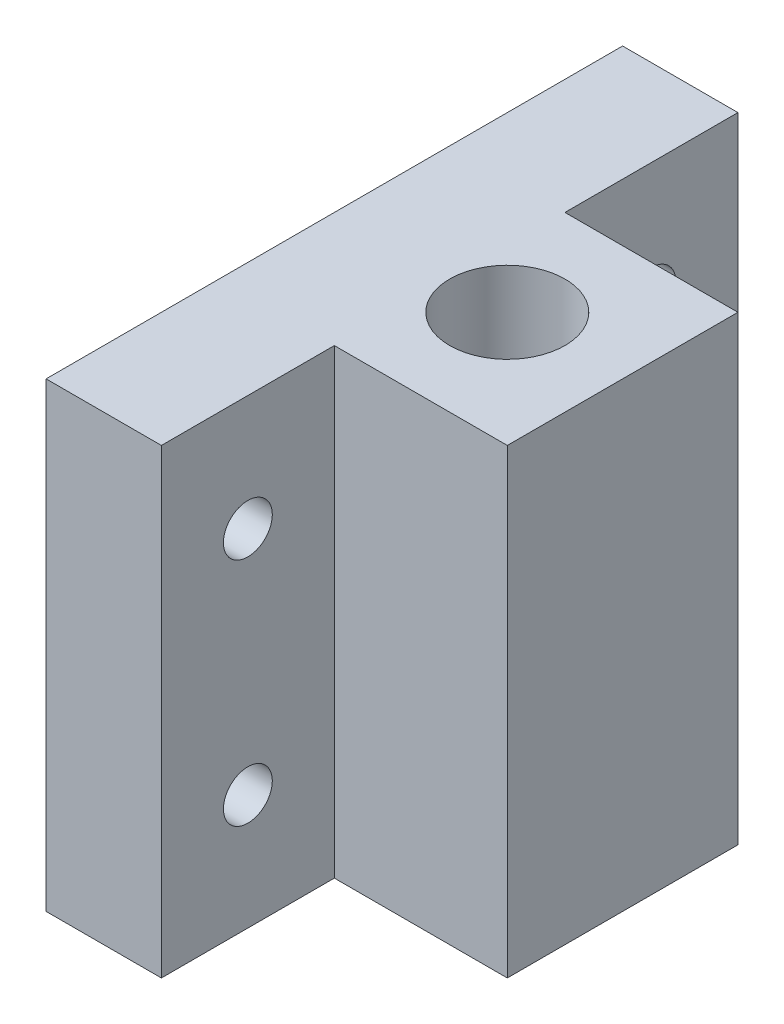
ISO-10303-21;
HEADER;
FILE_DESCRIPTION(('STEP AP214'),'2;1');
FILE_NAME('part.step','',(''),(''),'','','');
FILE_SCHEMA(('AUTOMOTIVE_DESIGN { 1 0 10303 214 1 1 1 1 }'));
ENDSEC;
DATA;
#1=APPLICATION_CONTEXT('core data for automotive mechanical design processes');
#2=APPLICATION_PROTOCOL_DEFINITION('international standard','automotive_design',2000,#1);
#3=PRODUCT_CONTEXT('',#1,'mechanical');
#4=PRODUCT('Part','Part','',(#3));
#5=PRODUCT_RELATED_PRODUCT_CATEGORY('part','',(#4));
#6=PRODUCT_DEFINITION_FORMATION('','',#4);
#7=PRODUCT_DEFINITION_CONTEXT('part definition',#1,'design');
#8=PRODUCT_DEFINITION('design','',#6,#7);
#9=PRODUCT_DEFINITION_SHAPE('','',#8);
#10=(LENGTH_UNIT() NAMED_UNIT(*) SI_UNIT(.MILLI.,.METRE.));
#11=(NAMED_UNIT(*) PLANE_ANGLE_UNIT() SI_UNIT($,.RADIAN.));
#12=(NAMED_UNIT(*) SI_UNIT($,.STERADIAN.) SOLID_ANGLE_UNIT());
#13=UNCERTAINTY_MEASURE_WITH_UNIT(LENGTH_MEASURE(1.E-05),#10,'distance_accuracy_value','');
#14=(GEOMETRIC_REPRESENTATION_CONTEXT(3) GLOBAL_UNCERTAINTY_ASSIGNED_CONTEXT((#13)) GLOBAL_UNIT_ASSIGNED_CONTEXT((#10,
#11,#12)) REPRESENTATION_CONTEXT('',''));
#15=CARTESIAN_POINT('',(0.,0.,0.));
#16=DIRECTION('',(0.,0.,1.));
#17=DIRECTION('',(1.,0.,0.));
#18=AXIS2_PLACEMENT_3D('',#15,#16,#17);
#19=CARTESIAN_POINT('',(30.,0.,0.));
#20=DIRECTION('',(0.,1.,0.));
#21=DIRECTION('',(0.,0.,1.));
#22=AXIS2_PLACEMENT_3D('',#19,#20,#21);
#23=CYLINDRICAL_SURFACE('',#22,8.);
#24=CARTESIAN_POINT('',(30.,28.,0.));
#25=DIRECTION('',(0.,1.,0.));
#26=DIRECTION('',(0.,0.,1.));
#27=AXIS2_PLACEMENT_3D('',#24,#25,#26);
#28=CIRCLE('',#27,8.);
#29=CARTESIAN_POINT('',(30.,28.,8.));
#30=VERTEX_POINT('',#29);
#31=EDGE_CURVE('E11',#30,#30,#28,.T.);
#32=ORIENTED_EDGE('',*,*,#31,.T.);
#33=EDGE_LOOP('',(#32));
#34=FACE_BOUND('',#33,.T.);
#35=CARTESIAN_POINT('',(30.,0.,0.));
#36=DIRECTION('',(0.,1.,0.));
#37=DIRECTION('',(0.,0.,1.));
#38=AXIS2_PLACEMENT_3D('',#35,#36,#37);
#39=CIRCLE('',#38,8.);
#40=CARTESIAN_POINT('',(30.,0.,8.));
#41=VERTEX_POINT('',#40);
#42=EDGE_CURVE('E236',#41,#41,#39,.T.);
#43=ORIENTED_EDGE('',*,*,#42,.F.);
#44=EDGE_LOOP('',(#43));
#45=FACE_BOUND('',#44,.T.);
#46=ADVANCED_FACE('F34',(#34,#45),#23,.F.);
#47=CARTESIAN_POINT('',(0.,80.,-20.));
#48=DIRECTION('',(0.,0.,1.));
#49=DIRECTION('',(1.,0.,0.));
#50=AXIS2_PLACEMENT_3D('',#47,#48,#49);
#51=PLANE('',#50);
#52=DIRECTION('',(0.,-1.,0.));
#53=VECTOR('',#52,1.);
#54=CARTESIAN_POINT('',(20.,80.,-20.));
#55=LINE('',#54,#53);
#56=CARTESIAN_POINT('',(20.,80.,-20.));
#57=VERTEX_POINT('',#56);
#58=CARTESIAN_POINT('',(20.,0.,-20.));
#59=VERTEX_POINT('',#58);
#60=EDGE_CURVE('E145',#57,#59,#55,.T.);
#61=ORIENTED_EDGE('',*,*,#60,.F.);
#62=DIRECTION('',(-1.,0.,0.));
#63=VECTOR('',#62,1.);
#64=CARTESIAN_POINT('',(0.,80.,-20.));
#65=LINE('',#64,#63);
#66=CARTESIAN_POINT('',(50.,80.,-20.));
#67=VERTEX_POINT('',#66);
#68=EDGE_CURVE('E151',#67,#57,#65,.T.);
#69=ORIENTED_EDGE('',*,*,#68,.F.);
#70=DIRECTION('',(0.,-1.,0.));
#71=VECTOR('',#70,1.);
#72=CARTESIAN_POINT('',(50.,80.,-20.));
#73=LINE('',#72,#71);
#74=CARTESIAN_POINT('',(50.,0.,-20.));
#75=VERTEX_POINT('',#74);
#76=EDGE_CURVE('E43',#67,#75,#73,.T.);
#77=ORIENTED_EDGE('',*,*,#76,.T.);
#78=DIRECTION('',(-1.,0.,0.));
#79=VECTOR('',#78,1.);
#80=CARTESIAN_POINT('',(0.,0.,-20.));
#81=LINE('',#80,#79);
#82=EDGE_CURVE('E160',#75,#59,#81,.T.);
#83=ORIENTED_EDGE('',*,*,#82,.T.);
#84=EDGE_LOOP('',(#61,#69,#77,#83));
#85=FACE_BOUND('',#84,.T.);
#86=ADVANCED_FACE('F171',(#85),#51,.F.);
#87=CARTESIAN_POINT('',(0.,80.,20.));
#88=DIRECTION('',(0.,0.,-1.));
#89=DIRECTION('',(-1.,0.,0.));
#90=AXIS2_PLACEMENT_3D('',#87,#88,#89);
#91=PLANE('',#90);
#92=DIRECTION('',(0.,1.,0.));
#93=VECTOR('',#92,1.);
#94=CARTESIAN_POINT('',(20.,80.,20.));
#95=LINE('',#94,#93);
#96=CARTESIAN_POINT('',(20.,0.,20.));
#97=VERTEX_POINT('',#96);
#98=CARTESIAN_POINT('',(20.,80.,20.));
#99=VERTEX_POINT('',#98);
#100=EDGE_CURVE('E54',#97,#99,#95,.T.);
#101=ORIENTED_EDGE('',*,*,#100,.F.);
#102=DIRECTION('',(1.,0.,0.));
#103=VECTOR('',#102,1.);
#104=CARTESIAN_POINT('',(0.,0.,20.));
#105=LINE('',#104,#103);
#106=CARTESIAN_POINT('',(50.,0.,20.));
#107=VERTEX_POINT('',#106);
#108=EDGE_CURVE('E152',#97,#107,#105,.T.);
#109=ORIENTED_EDGE('',*,*,#108,.T.);
#110=DIRECTION('',(0.,-1.,0.));
#111=VECTOR('',#110,1.);
#112=CARTESIAN_POINT('',(50.,80.,20.));
#113=LINE('',#112,#111);
#114=CARTESIAN_POINT('',(50.,80.,20.));
#115=VERTEX_POINT('',#114);
#116=EDGE_CURVE('E157',#115,#107,#113,.T.);
#117=ORIENTED_EDGE('',*,*,#116,.F.);
#118=DIRECTION('',(1.,0.,0.));
#119=VECTOR('',#118,1.);
#120=CARTESIAN_POINT('',(0.,80.,20.));
#121=LINE('',#120,#119);
#122=EDGE_CURVE('E50',#99,#115,#121,.T.);
#123=ORIENTED_EDGE('',*,*,#122,.F.);
#124=EDGE_LOOP('',(#101,#109,#117,#123));
#125=FACE_BOUND('',#124,.T.);
#126=ADVANCED_FACE('F183',(#125),#91,.F.);
#127=CARTESIAN_POINT('',(50.,80.,-20.));
#128=DIRECTION('',(-1.,0.,0.));
#129=DIRECTION('',(0.,0.,1.));
#130=AXIS2_PLACEMENT_3D('',#127,#128,#129);
#131=PLANE('',#130);
#132=DIRECTION('',(0.,0.,-1.));
#133=VECTOR('',#132,1.);
#134=CARTESIAN_POINT('',(50.,0.,-20.));
#135=LINE('',#134,#133);
#136=EDGE_CURVE('E147',#107,#75,#135,.T.);
#137=ORIENTED_EDGE('',*,*,#136,.T.);
#138=ORIENTED_EDGE('',*,*,#76,.F.);
#139=DIRECTION('',(0.,0.,-1.));
#140=VECTOR('',#139,1.);
#141=CARTESIAN_POINT('',(50.,80.,-20.));
#142=LINE('',#141,#140);
#143=EDGE_CURVE('E148',#115,#67,#142,.T.);
#144=ORIENTED_EDGE('',*,*,#143,.F.);
#145=ORIENTED_EDGE('',*,*,#116,.T.);
#146=EDGE_LOOP('',(#137,#138,#144,#145));
#147=FACE_BOUND('',#146,.T.);
#148=ADVANCED_FACE('F175',(#147),#131,.F.);
#149=CARTESIAN_POINT('',(0.,80.,-20.));
#150=DIRECTION('',(1.,0.,0.));
#151=DIRECTION('',(0.,0.,-1.));
#152=AXIS2_PLACEMENT_3D('',#149,#150,#151);
#153=PLANE('',#152);
#154=CARTESIAN_POINT('',(0.,60.,-35.));
#155=DIRECTION('',(-1.,0.,0.));
#156=DIRECTION('',(0.,0.,1.));
#157=AXIS2_PLACEMENT_3D('',#154,#155,#156);
#158=CIRCLE('',#157,4.24);
#159=CARTESIAN_POINT('',(0.,60.,-39.24));
#160=VERTEX_POINT('',#159);
#161=EDGE_CURVE('E248',#160,#160,#158,.T.);
#162=ORIENTED_EDGE('',*,*,#161,.F.);
#163=EDGE_LOOP('',(#162));
#164=FACE_BOUND('',#163,.T.);
#165=CARTESIAN_POINT('',(0.,20.,-35.));
#166=DIRECTION('',(-1.,0.,0.));
#167=DIRECTION('',(0.,0.,1.));
#168=AXIS2_PLACEMENT_3D('',#165,#166,#167);
#169=CIRCLE('',#168,4.24);
#170=CARTESIAN_POINT('',(0.,20.,-39.24));
#171=VERTEX_POINT('',#170);
#172=EDGE_CURVE('E241',#171,#171,#169,.T.);
#173=ORIENTED_EDGE('',*,*,#172,.F.);
#174=EDGE_LOOP('',(#173));
#175=FACE_BOUND('',#174,.T.);
#176=CARTESIAN_POINT('',(0.,60.,35.));
#177=DIRECTION('',(1.,0.,0.));
#178=DIRECTION('',(0.,0.,-1.));
#179=AXIS2_PLACEMENT_3D('',#176,#177,#178);
#180=CIRCLE('',#179,4.24);
#181=CARTESIAN_POINT('',(0.,60.,30.76));
#182=VERTEX_POINT('',#181);
#183=EDGE_CURVE('E137',#182,#182,#180,.T.);
#184=ORIENTED_EDGE('',*,*,#183,.T.);
#185=EDGE_LOOP('',(#184));
#186=FACE_BOUND('',#185,.T.);
#187=CARTESIAN_POINT('',(0.,20.,35.));
#188=DIRECTION('',(1.,0.,0.));
#189=DIRECTION('',(0.,0.,-1.));
#190=AXIS2_PLACEMENT_3D('',#187,#188,#189);
#191=CIRCLE('',#190,4.24);
#192=CARTESIAN_POINT('',(0.,20.,30.76));
#193=VERTEX_POINT('',#192);
#194=EDGE_CURVE('E260',#193,#193,#191,.T.);
#195=ORIENTED_EDGE('',*,*,#194,.T.);
#196=EDGE_LOOP('',(#195));
#197=FACE_BOUND('',#196,.T.);
#198=DIRECTION('',(0.,0.,1.));
#199=VECTOR('',#198,1.);
#200=CARTESIAN_POINT('',(0.,0.,-20.));
#201=LINE('',#200,#199);
#202=CARTESIAN_POINT('',(0.,0.,-50.));
#203=VERTEX_POINT('',#202);
#204=CARTESIAN_POINT('',(0.,0.,50.));
#205=VERTEX_POINT('',#204);
#206=EDGE_CURVE('E163',#203,#205,#201,.T.);
#207=ORIENTED_EDGE('',*,*,#206,.T.);
#208=DIRECTION('',(0.,1.,0.));
#209=VECTOR('',#208,1.);
#210=CARTESIAN_POINT('',(0.,80.,50.));
#211=LINE('',#210,#209);
#212=CARTESIAN_POINT('',(0.,80.,50.));
#213=VERTEX_POINT('',#212);
#214=EDGE_CURVE('E126',#205,#213,#211,.T.);
#215=ORIENTED_EDGE('',*,*,#214,.T.);
#216=DIRECTION('',(0.,0.,1.));
#217=VECTOR('',#216,1.);
#218=CARTESIAN_POINT('',(0.,80.,-20.));
#219=LINE('',#218,#217);
#220=CARTESIAN_POINT('',(0.,80.,-50.));
#221=VERTEX_POINT('',#220);
#222=EDGE_CURVE('E103',#221,#213,#219,.T.);
#223=ORIENTED_EDGE('',*,*,#222,.F.);
#224=DIRECTION('',(0.,-1.,0.));
#225=VECTOR('',#224,1.);
#226=CARTESIAN_POINT('',(0.,80.,-50.));
#227=LINE('',#226,#225);
#228=EDGE_CURVE('E123',#221,#203,#227,.T.);
#229=ORIENTED_EDGE('',*,*,#228,.T.);
#230=EDGE_LOOP('',(#207,#215,#223,#229));
#231=FACE_BOUND('',#230,.T.);
#232=ADVANCED_FACE('F190',(#164,#175,#186,#197,#231),#153,.F.);
#233=CARTESIAN_POINT('',(0.,80.,0.));
#234=DIRECTION('',(0.,1.,0.));
#235=DIRECTION('',(0.,0.,1.));
#236=AXIS2_PLACEMENT_3D('',#233,#234,#235);
#237=PLANE('',#236);
#238=CARTESIAN_POINT('',(30.,80.,0.));
#239=DIRECTION('',(0.,1.,0.));
#240=DIRECTION('',(0.,0.,1.));
#241=AXIS2_PLACEMENT_3D('',#238,#239,#240);
#242=CIRCLE('',#241,9.99999999999999);
#243=CARTESIAN_POINT('',(30.,80.,9.99999999999999));
#244=VERTEX_POINT('',#243);
#245=EDGE_CURVE('E244',#244,#244,#242,.T.);
#246=ORIENTED_EDGE('',*,*,#245,.F.);
#247=EDGE_LOOP('',(#246));
#248=FACE_BOUND('',#247,.T.);
#249=ORIENTED_EDGE('',*,*,#222,.T.);
#250=DIRECTION('',(-1.,0.,0.));
#251=VECTOR('',#250,1.);
#252=CARTESIAN_POINT('',(20.,80.,50.));
#253=LINE('',#252,#251);
#254=CARTESIAN_POINT('',(20.,80.,50.));
#255=VERTEX_POINT('',#254);
#256=EDGE_CURVE('E98',#255,#213,#253,.T.);
#257=ORIENTED_EDGE('',*,*,#256,.F.);
#258=DIRECTION('',(0.,0.,-1.));
#259=VECTOR('',#258,1.);
#260=CARTESIAN_POINT('',(20.,80.,-50.));
#261=LINE('',#260,#259);
#262=EDGE_CURVE('E101',#255,#99,#261,.T.);
#263=ORIENTED_EDGE('',*,*,#262,.T.);
#264=ORIENTED_EDGE('',*,*,#122,.T.);
#265=ORIENTED_EDGE('',*,*,#143,.T.);
#266=ORIENTED_EDGE('',*,*,#68,.T.);
#267=CARTESIAN_POINT('',(20.,80.,-50.));
#268=VERTEX_POINT('',#267);
#269=EDGE_CURVE('E117',#57,#268,#261,.T.);
#270=ORIENTED_EDGE('',*,*,#269,.T.);
#271=DIRECTION('',(-1.,0.,0.));
#272=VECTOR('',#271,1.);
#273=CARTESIAN_POINT('',(20.,80.,-50.));
#274=LINE('',#273,#272);
#275=EDGE_CURVE('E108',#268,#221,#274,.T.);
#276=ORIENTED_EDGE('',*,*,#275,.T.);
#277=EDGE_LOOP('',(#249,#257,#263,#264,#265,#266,#270,#276));
#278=FACE_BOUND('',#277,.T.);
#279=ADVANCED_FACE('F100',(#248,#278),#237,.T.);
#280=CARTESIAN_POINT('',(0.,0.,0.));
#281=DIRECTION('',(0.,1.,0.));
#282=DIRECTION('',(0.,0.,1.));
#283=AXIS2_PLACEMENT_3D('',#280,#281,#282);
#284=PLANE('',#283);
#285=ORIENTED_EDGE('',*,*,#42,.T.);
#286=EDGE_LOOP('',(#285));
#287=FACE_BOUND('',#286,.T.);
#288=ORIENTED_EDGE('',*,*,#206,.F.);
#289=DIRECTION('',(-1.,0.,0.));
#290=VECTOR('',#289,1.);
#291=CARTESIAN_POINT('',(20.,0.,-50.));
#292=LINE('',#291,#290);
#293=CARTESIAN_POINT('',(20.,0.,-50.));
#294=VERTEX_POINT('',#293);
#295=EDGE_CURVE('E140',#294,#203,#292,.T.);
#296=ORIENTED_EDGE('',*,*,#295,.F.);
#297=DIRECTION('',(0.,0.,1.));
#298=VECTOR('',#297,1.);
#299=CARTESIAN_POINT('',(20.,0.,-50.));
#300=LINE('',#299,#298);
#301=EDGE_CURVE('E109',#294,#59,#300,.T.);
#302=ORIENTED_EDGE('',*,*,#301,.T.);
#303=ORIENTED_EDGE('',*,*,#82,.F.);
#304=ORIENTED_EDGE('',*,*,#136,.F.);
#305=ORIENTED_EDGE('',*,*,#108,.F.);
#306=CARTESIAN_POINT('',(20.,0.,50.));
#307=VERTEX_POINT('',#306);
#308=EDGE_CURVE('E134',#97,#307,#300,.T.);
#309=ORIENTED_EDGE('',*,*,#308,.T.);
#310=DIRECTION('',(-1.,0.,0.));
#311=VECTOR('',#310,1.);
#312=CARTESIAN_POINT('',(20.,0.,50.));
#313=LINE('',#312,#311);
#314=EDGE_CURVE('E122',#307,#205,#313,.T.);
#315=ORIENTED_EDGE('',*,*,#314,.T.);
#316=EDGE_LOOP('',(#288,#296,#302,#303,#304,#305,#309,#315));
#317=FACE_BOUND('',#316,.T.);
#318=ADVANCED_FACE('F177',(#287,#317),#284,.F.);
#319=CARTESIAN_POINT('',(20.,80.,50.));
#320=DIRECTION('',(0.,0.,1.));
#321=DIRECTION('',(0.,-1.,0.));
#322=AXIS2_PLACEMENT_3D('',#319,#320,#321);
#323=PLANE('',#322);
#324=ORIENTED_EDGE('',*,*,#214,.F.);
#325=ORIENTED_EDGE('',*,*,#314,.F.);
#326=DIRECTION('',(0.,1.,0.));
#327=VECTOR('',#326,1.);
#328=CARTESIAN_POINT('',(20.,80.,50.));
#329=LINE('',#328,#327);
#330=EDGE_CURVE('E115',#307,#255,#329,.T.);
#331=ORIENTED_EDGE('',*,*,#330,.T.);
#332=ORIENTED_EDGE('',*,*,#256,.T.);
#333=EDGE_LOOP('',(#324,#325,#331,#332));
#334=FACE_BOUND('',#333,.T.);
#335=ADVANCED_FACE('F120',(#334),#323,.T.);
#336=CARTESIAN_POINT('',(20.,0.,0.));
#337=DIRECTION('',(-1.,0.,0.));
#338=DIRECTION('',(0.,0.,1.));
#339=AXIS2_PLACEMENT_3D('',#336,#337,#338);
#340=PLANE('',#339);
#341=CARTESIAN_POINT('',(20.,60.,35.));
#342=DIRECTION('',(1.,0.,0.));
#343=DIRECTION('',(0.,0.,-1.));
#344=AXIS2_PLACEMENT_3D('',#341,#342,#343);
#345=CIRCLE('',#344,4.24);
#346=CARTESIAN_POINT('',(20.,60.,30.76));
#347=VERTEX_POINT('',#346);
#348=EDGE_CURVE('E258',#347,#347,#345,.T.);
#349=ORIENTED_EDGE('',*,*,#348,.F.);
#350=EDGE_LOOP('',(#349));
#351=FACE_BOUND('',#350,.T.);
#352=CARTESIAN_POINT('',(20.,20.,35.));
#353=DIRECTION('',(1.,0.,0.));
#354=DIRECTION('',(0.,0.,-1.));
#355=AXIS2_PLACEMENT_3D('',#352,#353,#354);
#356=CIRCLE('',#355,4.24);
#357=CARTESIAN_POINT('',(20.,20.,30.76));
#358=VERTEX_POINT('',#357);
#359=EDGE_CURVE('E129',#358,#358,#356,.T.);
#360=ORIENTED_EDGE('',*,*,#359,.F.);
#361=EDGE_LOOP('',(#360));
#362=FACE_BOUND('',#361,.T.);
#363=ORIENTED_EDGE('',*,*,#308,.F.);
#364=ORIENTED_EDGE('',*,*,#100,.T.);
#365=ORIENTED_EDGE('',*,*,#262,.F.);
#366=ORIENTED_EDGE('',*,*,#330,.F.);
#367=EDGE_LOOP('',(#363,#364,#365,#366));
#368=FACE_BOUND('',#367,.T.);
#369=ADVANCED_FACE('F114',(#351,#362,#368),#340,.F.);
#370=CARTESIAN_POINT('',(20.,60.,-35.));
#371=DIRECTION('',(-1.,0.,0.));
#372=DIRECTION('',(0.,0.,1.));
#373=AXIS2_PLACEMENT_3D('',#370,#371,#372);
#374=CIRCLE('',#373,4.24);
#375=CARTESIAN_POINT('',(20.,60.,-39.24));
#376=VERTEX_POINT('',#375);
#377=EDGE_CURVE('E251',#376,#376,#374,.T.);
#378=ORIENTED_EDGE('',*,*,#377,.T.);
#379=EDGE_LOOP('',(#378));
#380=FACE_BOUND('',#379,.T.);
#381=CARTESIAN_POINT('',(20.,20.,-35.));
#382=DIRECTION('',(-1.,0.,0.));
#383=DIRECTION('',(0.,0.,1.));
#384=AXIS2_PLACEMENT_3D('',#381,#382,#383);
#385=CIRCLE('',#384,4.24);
#386=CARTESIAN_POINT('',(20.,20.,-39.24));
#387=VERTEX_POINT('',#386);
#388=EDGE_CURVE('E237',#387,#387,#385,.T.);
#389=ORIENTED_EDGE('',*,*,#388,.T.);
#390=EDGE_LOOP('',(#389));
#391=FACE_BOUND('',#390,.T.);
#392=ORIENTED_EDGE('',*,*,#269,.F.);
#393=ORIENTED_EDGE('',*,*,#60,.T.);
#394=ORIENTED_EDGE('',*,*,#301,.F.);
#395=DIRECTION('',(0.,-1.,0.));
#396=VECTOR('',#395,1.);
#397=CARTESIAN_POINT('',(20.,80.,-50.));
#398=LINE('',#397,#396);
#399=EDGE_CURVE('E116',#268,#294,#398,.T.);
#400=ORIENTED_EDGE('',*,*,#399,.F.);
#401=EDGE_LOOP('',(#392,#393,#394,#400));
#402=FACE_BOUND('',#401,.T.);
#403=ADVANCED_FACE('F181',(#380,#391,#402),#340,.F.);
#404=CARTESIAN_POINT('',(20.,80.,-50.));
#405=DIRECTION('',(0.,0.,-1.));
#406=DIRECTION('',(0.,1.,0.));
#407=AXIS2_PLACEMENT_3D('',#404,#405,#406);
#408=PLANE('',#407);
#409=ORIENTED_EDGE('',*,*,#228,.F.);
#410=ORIENTED_EDGE('',*,*,#275,.F.);
#411=ORIENTED_EDGE('',*,*,#399,.T.);
#412=ORIENTED_EDGE('',*,*,#295,.T.);
#413=EDGE_LOOP('',(#409,#410,#411,#412));
#414=FACE_BOUND('',#413,.T.);
#415=ADVANCED_FACE('F218',(#414),#408,.T.);
#416=CARTESIAN_POINT('',(0.,20.,35.));
#417=DIRECTION('',(1.,0.,0.));
#418=DIRECTION('',(0.,0.,-1.));
#419=AXIS2_PLACEMENT_3D('',#416,#417,#418);
#420=CYLINDRICAL_SURFACE('',#419,4.24);
#421=CARTESIAN_POINT('',(0.,20.,30.76));
#422=CARTESIAN_POINT('',(0.208333333333329,20.,30.76));
#423=CARTESIAN_POINT('',(0.416666666666663,20.,30.76));
#424=CARTESIAN_POINT('',(0.83333333333333,20.,30.76));
#425=CARTESIAN_POINT('',(1.04166666666666,20.,30.76));
#426=CARTESIAN_POINT('',(1.45833333333333,20.,30.76));
#427=CARTESIAN_POINT('',(1.66666666666666,20.,30.76));
#428=CARTESIAN_POINT('',(2.08333333333333,20.,30.76));
#429=CARTESIAN_POINT('',(2.29166666666666,20.,30.76));
#430=CARTESIAN_POINT('',(2.70833333333333,20.,30.76));
#431=CARTESIAN_POINT('',(2.91666666666666,20.,30.76));
#432=CARTESIAN_POINT('',(3.33333333333333,20.,30.76));
#433=CARTESIAN_POINT('',(3.54166666666666,20.,30.76));
#434=CARTESIAN_POINT('',(3.95833333333333,20.,30.76));
#435=CARTESIAN_POINT('',(4.16666666666666,20.,30.76));
#436=CARTESIAN_POINT('',(4.58333333333333,20.,30.76));
#437=CARTESIAN_POINT('',(4.79166666666666,20.,30.76));
#438=CARTESIAN_POINT('',(5.20833333333333,20.,30.76));
#439=CARTESIAN_POINT('',(5.41666666666667,20.,30.76));
#440=CARTESIAN_POINT('',(5.83333333333333,20.,30.76));
#441=CARTESIAN_POINT('',(6.04166666666667,20.,30.76));
#442=CARTESIAN_POINT('',(6.45833333333333,20.,30.76));
#443=CARTESIAN_POINT('',(6.66666666666667,20.,30.76));
#444=CARTESIAN_POINT('',(7.08333333333333,20.,30.76));
#445=CARTESIAN_POINT('',(7.29166666666667,20.,30.76));
#446=CARTESIAN_POINT('',(7.70833333333333,20.,30.76));
#447=CARTESIAN_POINT('',(7.91666666666667,20.,30.76));
#448=CARTESIAN_POINT('',(8.33333333333333,20.,30.76));
#449=CARTESIAN_POINT('',(8.54166666666667,20.,30.76));
#450=CARTESIAN_POINT('',(8.95833333333333,20.,30.76));
#451=CARTESIAN_POINT('',(9.16666666666667,20.,30.76));
#452=CARTESIAN_POINT('',(9.58333333333333,20.,30.76));
#453=CARTESIAN_POINT('',(9.79166666666667,20.,30.76));
#454=CARTESIAN_POINT('',(10.2083333333333,20.,30.76));
#455=CARTESIAN_POINT('',(10.4166666666667,20.,30.76));
#456=CARTESIAN_POINT('',(10.8333333333333,20.,30.76));
#457=CARTESIAN_POINT('',(11.0416666666667,20.,30.76));
#458=CARTESIAN_POINT('',(11.4583333333333,20.,30.76));
#459=CARTESIAN_POINT('',(11.6666666666667,20.,30.76));
#460=CARTESIAN_POINT('',(12.0833333333333,20.,30.76));
#461=CARTESIAN_POINT('',(12.2916666666667,20.,30.76));
#462=CARTESIAN_POINT('',(12.7083333333333,20.,30.76));
#463=CARTESIAN_POINT('',(12.9166666666667,20.,30.76));
#464=CARTESIAN_POINT('',(13.3333333333333,20.,30.76));
#465=CARTESIAN_POINT('',(13.5416666666667,20.,30.76));
#466=CARTESIAN_POINT('',(13.9583333333333,20.,30.76));
#467=CARTESIAN_POINT('',(14.1666666666667,20.,30.76));
#468=CARTESIAN_POINT('',(14.5833333333333,20.,30.76));
#469=CARTESIAN_POINT('',(14.7916666666667,20.,30.76));
#470=CARTESIAN_POINT('',(15.2083333333333,20.,30.76));
#471=CARTESIAN_POINT('',(15.4166666666667,20.,30.76));
#472=CARTESIAN_POINT('',(15.8333333333333,20.,30.76));
#473=CARTESIAN_POINT('',(16.0416666666667,20.,30.76));
#474=CARTESIAN_POINT('',(16.4583333333333,20.,30.76));
#475=CARTESIAN_POINT('',(16.6666666666667,20.,30.76));
#476=CARTESIAN_POINT('',(17.0833333333333,20.,30.76));
#477=CARTESIAN_POINT('',(17.2916666666667,20.,30.76));
#478=CARTESIAN_POINT('',(17.7083333333333,20.,30.76));
#479=CARTESIAN_POINT('',(17.9166666666667,20.,30.76));
#480=CARTESIAN_POINT('',(18.3333333333333,20.,30.76));
#481=CARTESIAN_POINT('',(18.5416666666667,20.,30.76));
#482=CARTESIAN_POINT('',(18.9583333333333,20.,30.76));
#483=CARTESIAN_POINT('',(19.1666666666667,20.,30.76));
#484=CARTESIAN_POINT('',(19.5833333333333,20.,30.76));
#485=CARTESIAN_POINT('',(19.7916666666667,20.,30.76));
#486=CARTESIAN_POINT('',(20.,20.,30.76));
#487=B_SPLINE_CURVE_WITH_KNOTS('',3,(#421,#422,#423,#424,#425,#426,#427,#428,#429,#430,#431,
#432,#433,#434,#435,#436,#437,#438,#439,#440,#441,#442,#443,#444,#445,#446,#447,#448,#449,#450,
#451,#452,#453,#454,#455,#456,#457,#458,#459,#460,#461,#462,#463,#464,#465,#466,#467,#468,#469,
#470,#471,#472,#473,#474,#475,#476,#477,#478,#479,#480,#481,#482,#483,#484,#485,#486),
.UNSPECIFIED.,.F.,.F.,(4,2,2,2,2,2,2,2,2,2,2,2,2,2,2,2,2,2,2,2,2,2,2,2,2,2,2,2,2,2,2,2,4),(0.,
0.625,1.25,1.875,2.5,3.125,3.75,4.375,5.,5.625,6.25,6.875,7.5,8.125,8.75,9.37500000000001,10.,
10.625,11.25,11.875,12.5,13.125,13.75,14.375,15.,15.625,16.25,16.875,17.5,18.125,18.75,19.375,
20.),.UNSPECIFIED.);
#488=EDGE_CURVE('BSEAM214',#193,#358,#487,.T.);
#489=ORIENTED_EDGE('',*,*,#194,.F.);
#490=ORIENTED_EDGE('',*,*,#359,.T.);
#491=ORIENTED_EDGE('',*,*,#488,.T.);
#492=ORIENTED_EDGE('',*,*,#488,.F.);
#493=EDGE_LOOP('',(#489,#491,#490,#492));
#494=FACE_BOUND('',#493,.T.);
#495=ADVANCED_FACE('F214',(#494),#420,.F.);
#496=CARTESIAN_POINT('',(0.,60.,35.));
#497=DIRECTION('',(1.,0.,0.));
#498=DIRECTION('',(0.,0.,-1.));
#499=AXIS2_PLACEMENT_3D('',#496,#497,#498);
#500=CYLINDRICAL_SURFACE('',#499,4.24);
#501=CARTESIAN_POINT('',(0.,60.,30.76));
#502=CARTESIAN_POINT('',(0.208333333333329,60.,30.76));
#503=CARTESIAN_POINT('',(0.416666666666663,60.,30.76));
#504=CARTESIAN_POINT('',(0.83333333333333,60.,30.76));
#505=CARTESIAN_POINT('',(1.04166666666666,60.,30.76));
#506=CARTESIAN_POINT('',(1.45833333333333,60.,30.76));
#507=CARTESIAN_POINT('',(1.66666666666666,60.,30.76));
#508=CARTESIAN_POINT('',(2.08333333333333,60.,30.76));
#509=CARTESIAN_POINT('',(2.29166666666666,60.,30.76));
#510=CARTESIAN_POINT('',(2.70833333333333,60.,30.76));
#511=CARTESIAN_POINT('',(2.91666666666666,60.,30.76));
#512=CARTESIAN_POINT('',(3.33333333333333,60.,30.76));
#513=CARTESIAN_POINT('',(3.54166666666666,60.,30.76));
#514=CARTESIAN_POINT('',(3.95833333333333,60.,30.76));
#515=CARTESIAN_POINT('',(4.16666666666666,60.,30.76));
#516=CARTESIAN_POINT('',(4.58333333333333,60.,30.76));
#517=CARTESIAN_POINT('',(4.79166666666666,60.,30.76));
#518=CARTESIAN_POINT('',(5.20833333333333,60.,30.76));
#519=CARTESIAN_POINT('',(5.41666666666667,60.,30.76));
#520=CARTESIAN_POINT('',(5.83333333333333,60.,30.76));
#521=CARTESIAN_POINT('',(6.04166666666667,60.,30.76));
#522=CARTESIAN_POINT('',(6.45833333333333,60.,30.76));
#523=CARTESIAN_POINT('',(6.66666666666667,60.,30.76));
#524=CARTESIAN_POINT('',(7.08333333333333,60.,30.76));
#525=CARTESIAN_POINT('',(7.29166666666667,60.,30.76));
#526=CARTESIAN_POINT('',(7.70833333333333,60.,30.76));
#527=CARTESIAN_POINT('',(7.91666666666667,60.,30.76));
#528=CARTESIAN_POINT('',(8.33333333333333,60.,30.76));
#529=CARTESIAN_POINT('',(8.54166666666667,60.,30.76));
#530=CARTESIAN_POINT('',(8.95833333333333,60.,30.76));
#531=CARTESIAN_POINT('',(9.16666666666667,60.,30.76));
#532=CARTESIAN_POINT('',(9.58333333333333,60.,30.76));
#533=CARTESIAN_POINT('',(9.79166666666667,60.,30.76));
#534=CARTESIAN_POINT('',(10.2083333333333,60.,30.76));
#535=CARTESIAN_POINT('',(10.4166666666667,60.,30.76));
#536=CARTESIAN_POINT('',(10.8333333333333,60.,30.76));
#537=CARTESIAN_POINT('',(11.0416666666667,60.,30.76));
#538=CARTESIAN_POINT('',(11.4583333333333,60.,30.76));
#539=CARTESIAN_POINT('',(11.6666666666667,60.,30.76));
#540=CARTESIAN_POINT('',(12.0833333333333,60.,30.76));
#541=CARTESIAN_POINT('',(12.2916666666667,60.,30.76));
#542=CARTESIAN_POINT('',(12.7083333333333,60.,30.76));
#543=CARTESIAN_POINT('',(12.9166666666667,60.,30.76));
#544=CARTESIAN_POINT('',(13.3333333333333,60.,30.76));
#545=CARTESIAN_POINT('',(13.5416666666667,60.,30.76));
#546=CARTESIAN_POINT('',(13.9583333333333,60.,30.76));
#547=CARTESIAN_POINT('',(14.1666666666667,60.,30.76));
#548=CARTESIAN_POINT('',(14.5833333333333,60.,30.76));
#549=CARTESIAN_POINT('',(14.7916666666667,60.,30.76));
#550=CARTESIAN_POINT('',(15.2083333333333,60.,30.76));
#551=CARTESIAN_POINT('',(15.4166666666667,60.,30.76));
#552=CARTESIAN_POINT('',(15.8333333333333,60.,30.76));
#553=CARTESIAN_POINT('',(16.0416666666667,60.,30.76));
#554=CARTESIAN_POINT('',(16.4583333333333,60.,30.76));
#555=CARTESIAN_POINT('',(16.6666666666667,60.,30.76));
#556=CARTESIAN_POINT('',(17.0833333333333,60.,30.76));
#557=CARTESIAN_POINT('',(17.2916666666667,60.,30.76));
#558=CARTESIAN_POINT('',(17.7083333333333,60.,30.76));
#559=CARTESIAN_POINT('',(17.9166666666667,60.,30.76));
#560=CARTESIAN_POINT('',(18.3333333333333,60.,30.76));
#561=CARTESIAN_POINT('',(18.5416666666667,60.,30.76));
#562=CARTESIAN_POINT('',(18.9583333333333,60.,30.76));
#563=CARTESIAN_POINT('',(19.1666666666667,60.,30.76));
#564=CARTESIAN_POINT('',(19.5833333333333,60.,30.76));
#565=CARTESIAN_POINT('',(19.7916666666667,60.,30.76));
#566=CARTESIAN_POINT('',(20.,60.,30.76));
#567=B_SPLINE_CURVE_WITH_KNOTS('',3,(#501,#502,#503,#504,#505,#506,#507,#508,#509,#510,#511,
#512,#513,#514,#515,#516,#517,#518,#519,#520,#521,#522,#523,#524,#525,#526,#527,#528,#529,#530,
#531,#532,#533,#534,#535,#536,#537,#538,#539,#540,#541,#542,#543,#544,#545,#546,#547,#548,#549,
#550,#551,#552,#553,#554,#555,#556,#557,#558,#559,#560,#561,#562,#563,#564,#565,#566),
.UNSPECIFIED.,.F.,.F.,(4,2,2,2,2,2,2,2,2,2,2,2,2,2,2,2,2,2,2,2,2,2,2,2,2,2,2,2,2,2,2,2,4),(0.,
0.625,1.25,1.875,2.5,3.125,3.75,4.375,5.,5.625,6.25,6.875,7.5,8.125,8.75,9.37500000000001,10.,
10.625,11.25,11.875,12.5,13.125,13.75,14.375,15.,15.625,16.25,16.875,17.5,18.125,18.75,19.375,
20.),.UNSPECIFIED.);
#568=EDGE_CURVE('BSEAM210',#182,#347,#567,.T.);
#569=ORIENTED_EDGE('',*,*,#183,.F.);
#570=ORIENTED_EDGE('',*,*,#348,.T.);
#571=ORIENTED_EDGE('',*,*,#568,.T.);
#572=ORIENTED_EDGE('',*,*,#568,.F.);
#573=EDGE_LOOP('',(#569,#571,#570,#572));
#574=FACE_BOUND('',#573,.T.);
#575=ADVANCED_FACE('F210',(#574),#500,.F.);
#576=CARTESIAN_POINT('',(0.,20.,-35.));
#577=DIRECTION('',(1.,0.,0.));
#578=DIRECTION('',(0.,0.,-1.));
#579=AXIS2_PLACEMENT_3D('',#576,#577,#578);
#580=CYLINDRICAL_SURFACE('',#579,4.24);
#581=CARTESIAN_POINT('',(0.,20.,-39.24));
#582=CARTESIAN_POINT('',(0.20833333333333,20.,-39.24));
#583=CARTESIAN_POINT('',(0.416666666666664,20.,-39.24));
#584=CARTESIAN_POINT('',(0.83333333333333,20.,-39.24));
#585=CARTESIAN_POINT('',(1.04166666666666,20.,-39.24));
#586=CARTESIAN_POINT('',(1.45833333333333,20.,-39.24));
#587=CARTESIAN_POINT('',(1.66666666666666,20.,-39.24));
#588=CARTESIAN_POINT('',(2.08333333333333,20.,-39.24));
#589=CARTESIAN_POINT('',(2.29166666666666,20.,-39.24));
#590=CARTESIAN_POINT('',(2.70833333333333,20.,-39.24));
#591=CARTESIAN_POINT('',(2.91666666666667,20.,-39.24));
#592=CARTESIAN_POINT('',(3.33333333333333,20.,-39.24));
#593=CARTESIAN_POINT('',(3.54166666666667,20.,-39.24));
#594=CARTESIAN_POINT('',(3.95833333333333,20.,-39.24));
#595=CARTESIAN_POINT('',(4.16666666666667,20.,-39.24));
#596=CARTESIAN_POINT('',(4.58333333333333,20.,-39.24));
#597=CARTESIAN_POINT('',(4.79166666666666,20.,-39.24));
#598=CARTESIAN_POINT('',(5.20833333333333,20.,-39.24));
#599=CARTESIAN_POINT('',(5.41666666666667,20.,-39.24));
#600=CARTESIAN_POINT('',(5.83333333333333,20.,-39.24));
#601=CARTESIAN_POINT('',(6.04166666666667,20.,-39.24));
#602=CARTESIAN_POINT('',(6.45833333333333,20.,-39.24));
#603=CARTESIAN_POINT('',(6.66666666666667,20.,-39.24));
#604=CARTESIAN_POINT('',(7.08333333333333,20.,-39.24));
#605=CARTESIAN_POINT('',(7.29166666666667,20.,-39.24));
#606=CARTESIAN_POINT('',(7.70833333333333,20.,-39.24));
#607=CARTESIAN_POINT('',(7.91666666666667,20.,-39.24));
#608=CARTESIAN_POINT('',(8.33333333333333,20.,-39.24));
#609=CARTESIAN_POINT('',(8.54166666666667,20.,-39.24));
#610=CARTESIAN_POINT('',(8.95833333333333,20.,-39.24));
#611=CARTESIAN_POINT('',(9.16666666666667,20.,-39.24));
#612=CARTESIAN_POINT('',(9.58333333333333,20.,-39.24));
#613=CARTESIAN_POINT('',(9.79166666666667,20.,-39.24));
#614=CARTESIAN_POINT('',(10.2083333333333,20.,-39.24));
#615=CARTESIAN_POINT('',(10.4166666666667,20.,-39.24));
#616=CARTESIAN_POINT('',(10.8333333333333,20.,-39.24));
#617=CARTESIAN_POINT('',(11.0416666666667,20.,-39.24));
#618=CARTESIAN_POINT('',(11.4583333333333,20.,-39.24));
#619=CARTESIAN_POINT('',(11.6666666666667,20.,-39.24));
#620=CARTESIAN_POINT('',(12.0833333333333,20.,-39.24));
#621=CARTESIAN_POINT('',(12.2916666666667,20.,-39.24));
#622=CARTESIAN_POINT('',(12.7083333333333,20.,-39.24));
#623=CARTESIAN_POINT('',(12.9166666666667,20.,-39.24));
#624=CARTESIAN_POINT('',(13.3333333333333,20.,-39.24));
#625=CARTESIAN_POINT('',(13.5416666666667,20.,-39.24));
#626=CARTESIAN_POINT('',(13.9583333333333,20.,-39.24));
#627=CARTESIAN_POINT('',(14.1666666666667,20.,-39.24));
#628=CARTESIAN_POINT('',(14.5833333333333,20.,-39.24));
#629=CARTESIAN_POINT('',(14.7916666666667,20.,-39.24));
#630=CARTESIAN_POINT('',(15.2083333333333,20.,-39.24));
#631=CARTESIAN_POINT('',(15.4166666666667,20.,-39.24));
#632=CARTESIAN_POINT('',(15.8333333333333,20.,-39.24));
#633=CARTESIAN_POINT('',(16.0416666666667,20.,-39.24));
#634=CARTESIAN_POINT('',(16.4583333333333,20.,-39.24));
#635=CARTESIAN_POINT('',(16.6666666666667,20.,-39.24));
#636=CARTESIAN_POINT('',(17.0833333333333,20.,-39.24));
#637=CARTESIAN_POINT('',(17.2916666666667,20.,-39.24));
#638=CARTESIAN_POINT('',(17.7083333333333,20.,-39.24));
#639=CARTESIAN_POINT('',(17.9166666666667,20.,-39.24));
#640=CARTESIAN_POINT('',(18.3333333333333,20.,-39.24));
#641=CARTESIAN_POINT('',(18.5416666666667,20.,-39.24));
#642=CARTESIAN_POINT('',(18.9583333333333,20.,-39.24));
#643=CARTESIAN_POINT('',(19.1666666666667,20.,-39.24));
#644=CARTESIAN_POINT('',(19.5833333333333,20.,-39.24));
#645=CARTESIAN_POINT('',(19.7916666666667,20.,-39.24));
#646=CARTESIAN_POINT('',(20.,20.,-39.24));
#647=B_SPLINE_CURVE_WITH_KNOTS('',3,(#581,#582,#583,#584,#585,#586,#587,#588,#589,#590,#591,
#592,#593,#594,#595,#596,#597,#598,#599,#600,#601,#602,#603,#604,#605,#606,#607,#608,#609,#610,
#611,#612,#613,#614,#615,#616,#617,#618,#619,#620,#621,#622,#623,#624,#625,#626,#627,#628,#629,
#630,#631,#632,#633,#634,#635,#636,#637,#638,#639,#640,#641,#642,#643,#644,#645,#646),
.UNSPECIFIED.,.F.,.F.,(4,2,2,2,2,2,2,2,2,2,2,2,2,2,2,2,2,2,2,2,2,2,2,2,2,2,2,2,2,2,2,2,4),(0.,
0.625,1.25,1.875,2.5,3.125,3.75,4.375,5.,5.625,6.25,6.875,7.5,8.125,8.75,9.375,10.,10.625,11.25,
11.875,12.5,13.125,13.75,14.375,15.,15.625,16.25,16.875,17.5,18.125,18.75,19.375,20.),.UNSPECIFIED.);
#648=EDGE_CURVE('BSEAM206',#171,#387,#647,.T.);
#649=ORIENTED_EDGE('',*,*,#172,.T.);
#650=ORIENTED_EDGE('',*,*,#388,.F.);
#651=ORIENTED_EDGE('',*,*,#648,.T.);
#652=ORIENTED_EDGE('',*,*,#648,.F.);
#653=EDGE_LOOP('',(#649,#651,#650,#652));
#654=FACE_BOUND('',#653,.T.);
#655=ADVANCED_FACE('F206',(#654),#580,.F.);
#656=CARTESIAN_POINT('',(0.,60.,-35.));
#657=DIRECTION('',(1.,0.,0.));
#658=DIRECTION('',(0.,0.,-1.));
#659=AXIS2_PLACEMENT_3D('',#656,#657,#658);
#660=CYLINDRICAL_SURFACE('',#659,4.24);
#661=CARTESIAN_POINT('',(0.,60.,-39.24));
#662=CARTESIAN_POINT('',(0.20833333333333,60.,-39.24));
#663=CARTESIAN_POINT('',(0.416666666666664,60.,-39.24));
#664=CARTESIAN_POINT('',(0.83333333333333,60.,-39.24));
#665=CARTESIAN_POINT('',(1.04166666666666,60.,-39.24));
#666=CARTESIAN_POINT('',(1.45833333333333,60.,-39.24));
#667=CARTESIAN_POINT('',(1.66666666666666,60.,-39.24));
#668=CARTESIAN_POINT('',(2.08333333333333,60.,-39.24));
#669=CARTESIAN_POINT('',(2.29166666666666,60.,-39.24));
#670=CARTESIAN_POINT('',(2.70833333333333,60.,-39.24));
#671=CARTESIAN_POINT('',(2.91666666666667,60.,-39.24));
#672=CARTESIAN_POINT('',(3.33333333333333,60.,-39.24));
#673=CARTESIAN_POINT('',(3.54166666666667,60.,-39.24));
#674=CARTESIAN_POINT('',(3.95833333333333,60.,-39.24));
#675=CARTESIAN_POINT('',(4.16666666666667,60.,-39.24));
#676=CARTESIAN_POINT('',(4.58333333333333,60.,-39.24));
#677=CARTESIAN_POINT('',(4.79166666666666,60.,-39.24));
#678=CARTESIAN_POINT('',(5.20833333333333,60.,-39.24));
#679=CARTESIAN_POINT('',(5.41666666666667,60.,-39.24));
#680=CARTESIAN_POINT('',(5.83333333333333,60.,-39.24));
#681=CARTESIAN_POINT('',(6.04166666666667,60.,-39.24));
#682=CARTESIAN_POINT('',(6.45833333333333,60.,-39.24));
#683=CARTESIAN_POINT('',(6.66666666666667,60.,-39.24));
#684=CARTESIAN_POINT('',(7.08333333333333,60.,-39.24));
#685=CARTESIAN_POINT('',(7.29166666666667,60.,-39.24));
#686=CARTESIAN_POINT('',(7.70833333333333,60.,-39.24));
#687=CARTESIAN_POINT('',(7.91666666666667,60.,-39.24));
#688=CARTESIAN_POINT('',(8.33333333333333,60.,-39.24));
#689=CARTESIAN_POINT('',(8.54166666666667,60.,-39.24));
#690=CARTESIAN_POINT('',(8.95833333333333,60.,-39.24));
#691=CARTESIAN_POINT('',(9.16666666666667,60.,-39.24));
#692=CARTESIAN_POINT('',(9.58333333333333,60.,-39.24));
#693=CARTESIAN_POINT('',(9.79166666666667,60.,-39.24));
#694=CARTESIAN_POINT('',(10.2083333333333,60.,-39.24));
#695=CARTESIAN_POINT('',(10.4166666666667,60.,-39.24));
#696=CARTESIAN_POINT('',(10.8333333333333,60.,-39.24));
#697=CARTESIAN_POINT('',(11.0416666666667,60.,-39.24));
#698=CARTESIAN_POINT('',(11.4583333333333,60.,-39.24));
#699=CARTESIAN_POINT('',(11.6666666666667,60.,-39.24));
#700=CARTESIAN_POINT('',(12.0833333333333,60.,-39.24));
#701=CARTESIAN_POINT('',(12.2916666666667,60.,-39.24));
#702=CARTESIAN_POINT('',(12.7083333333333,60.,-39.24));
#703=CARTESIAN_POINT('',(12.9166666666667,60.,-39.24));
#704=CARTESIAN_POINT('',(13.3333333333333,60.,-39.24));
#705=CARTESIAN_POINT('',(13.5416666666667,60.,-39.24));
#706=CARTESIAN_POINT('',(13.9583333333333,60.,-39.24));
#707=CARTESIAN_POINT('',(14.1666666666667,60.,-39.24));
#708=CARTESIAN_POINT('',(14.5833333333333,60.,-39.24));
#709=CARTESIAN_POINT('',(14.7916666666667,60.,-39.24));
#710=CARTESIAN_POINT('',(15.2083333333333,60.,-39.24));
#711=CARTESIAN_POINT('',(15.4166666666667,60.,-39.24));
#712=CARTESIAN_POINT('',(15.8333333333333,60.,-39.24));
#713=CARTESIAN_POINT('',(16.0416666666667,60.,-39.24));
#714=CARTESIAN_POINT('',(16.4583333333333,60.,-39.24));
#715=CARTESIAN_POINT('',(16.6666666666667,60.,-39.24));
#716=CARTESIAN_POINT('',(17.0833333333333,60.,-39.24));
#717=CARTESIAN_POINT('',(17.2916666666667,60.,-39.24));
#718=CARTESIAN_POINT('',(17.7083333333333,60.,-39.24));
#719=CARTESIAN_POINT('',(17.9166666666667,60.,-39.24));
#720=CARTESIAN_POINT('',(18.3333333333333,60.,-39.24));
#721=CARTESIAN_POINT('',(18.5416666666667,60.,-39.24));
#722=CARTESIAN_POINT('',(18.9583333333333,60.,-39.24));
#723=CARTESIAN_POINT('',(19.1666666666667,60.,-39.24));
#724=CARTESIAN_POINT('',(19.5833333333333,60.,-39.24));
#725=CARTESIAN_POINT('',(19.7916666666667,60.,-39.24));
#726=CARTESIAN_POINT('',(20.,60.,-39.24));
#727=B_SPLINE_CURVE_WITH_KNOTS('',3,(#661,#662,#663,#664,#665,#666,#667,#668,#669,#670,#671,
#672,#673,#674,#675,#676,#677,#678,#679,#680,#681,#682,#683,#684,#685,#686,#687,#688,#689,#690,
#691,#692,#693,#694,#695,#696,#697,#698,#699,#700,#701,#702,#703,#704,#705,#706,#707,#708,#709,
#710,#711,#712,#713,#714,#715,#716,#717,#718,#719,#720,#721,#722,#723,#724,#725,#726),
.UNSPECIFIED.,.F.,.F.,(4,2,2,2,2,2,2,2,2,2,2,2,2,2,2,2,2,2,2,2,2,2,2,2,2,2,2,2,2,2,2,2,4),(0.,
0.625,1.25,1.875,2.5,3.125,3.75,4.375,5.,5.625,6.25,6.875,7.5,8.125,8.75,9.375,10.,10.625,11.25,
11.875,12.5,13.125,13.75,14.375,15.,15.625,16.25,16.875,17.5,18.125,18.75,19.375,20.),.UNSPECIFIED.);
#728=EDGE_CURVE('BSEAM203',#160,#376,#727,.T.);
#729=ORIENTED_EDGE('',*,*,#161,.T.);
#730=ORIENTED_EDGE('',*,*,#377,.F.);
#731=ORIENTED_EDGE('',*,*,#728,.T.);
#732=ORIENTED_EDGE('',*,*,#728,.F.);
#733=EDGE_LOOP('',(#729,#731,#730,#732));
#734=FACE_BOUND('',#733,.T.);
#735=ADVANCED_FACE('F203',(#734),#660,.F.);
#736=CARTESIAN_POINT('',(30.,30.,0.));
#737=DIRECTION('',(0.,1.,0.));
#738=DIRECTION('',(0.,0.,1.));
#739=AXIS2_PLACEMENT_3D('',#736,#737,#738);
#740=CYLINDRICAL_SURFACE('',#739,9.99999999999999);
#741=CARTESIAN_POINT('',(30.,30.,0.));
#742=DIRECTION('',(0.,1.,0.));
#743=DIRECTION('',(0.,0.,1.));
#744=AXIS2_PLACEMENT_3D('',#741,#742,#743);
#745=CIRCLE('',#744,9.99999999999999);
#746=CARTESIAN_POINT('',(30.,30.,9.99999999999999));
#747=VERTEX_POINT('',#746);
#748=EDGE_CURVE('E238',#747,#747,#745,.T.);
#749=ORIENTED_EDGE('',*,*,#748,.F.);
#750=EDGE_LOOP('',(#749));
#751=FACE_BOUND('',#750,.T.);
#752=ORIENTED_EDGE('',*,*,#245,.T.);
#753=EDGE_LOOP('',(#752));
#754=FACE_BOUND('',#753,.T.);
#755=ADVANCED_FACE('F202',(#751,#754),#740,.F.);
#756=CARTESIAN_POINT('',(30.,30.,0.));
#757=DIRECTION('',(0.,1.,0.));
#758=DIRECTION('',(0.,0.,1.));
#759=AXIS2_PLACEMENT_3D('',#756,#757,#758);
#760=CONICAL_SURFACE('',#759,10.,0.785398163397449);
#761=ORIENTED_EDGE('',*,*,#31,.F.);
#762=EDGE_LOOP('',(#761));
#763=FACE_BOUND('',#762,.T.);
#764=ORIENTED_EDGE('',*,*,#748,.T.);
#765=EDGE_LOOP('',(#764));
#766=FACE_BOUND('',#765,.T.);
#767=ADVANCED_FACE('F37',(#763,#766),#760,.F.);
#768=CLOSED_SHELL('',(#46,#86,#126,#148,#232,#279,#318,#335,#369,#403,#415,#495,#575,#655,#735,
#755,#767));
#769=MANIFOLD_SOLID_BREP('B2',#768);
#770=ADVANCED_BREP_SHAPE_REPRESENTATION('',(#18,#769),#14);
#771=SHAPE_DEFINITION_REPRESENTATION(#9,#770);
ENDSEC;
END-ISO-10303-21;
